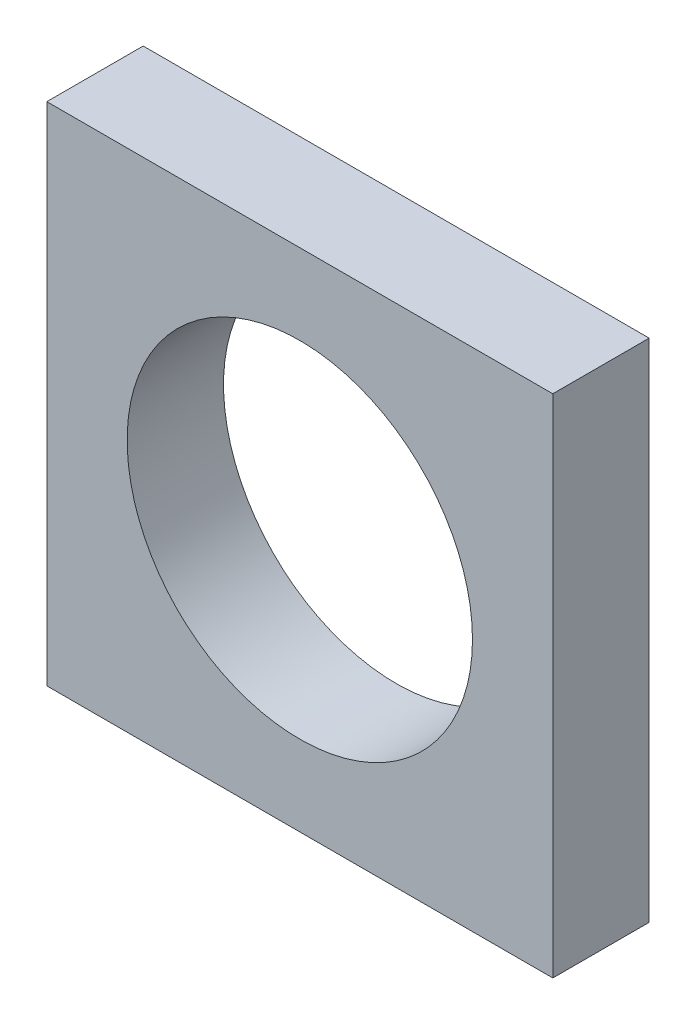
ISO-10303-21;
HEADER;
FILE_DESCRIPTION(('STEP AP214'),'2;1');
FILE_NAME('part.step','',(''),(''),'','','');
FILE_SCHEMA(('AUTOMOTIVE_DESIGN { 1 0 10303 214 1 1 1 1 }'));
ENDSEC;
DATA;
#1=APPLICATION_CONTEXT('core data for automotive mechanical design processes');
#2=APPLICATION_PROTOCOL_DEFINITION('international standard','automotive_design',2000,#1);
#3=PRODUCT_CONTEXT('',#1,'mechanical');
#4=PRODUCT('Part','Part','',(#3));
#5=PRODUCT_RELATED_PRODUCT_CATEGORY('part','',(#4));
#6=PRODUCT_DEFINITION_FORMATION('','',#4);
#7=PRODUCT_DEFINITION_CONTEXT('part definition',#1,'design');
#8=PRODUCT_DEFINITION('design','',#6,#7);
#9=PRODUCT_DEFINITION_SHAPE('','',#8);
#10=(LENGTH_UNIT() NAMED_UNIT(*) SI_UNIT(.MILLI.,.METRE.));
#11=(NAMED_UNIT(*) PLANE_ANGLE_UNIT() SI_UNIT($,.RADIAN.));
#12=(NAMED_UNIT(*) SI_UNIT($,.STERADIAN.) SOLID_ANGLE_UNIT());
#13=UNCERTAINTY_MEASURE_WITH_UNIT(LENGTH_MEASURE(1.E-05),#10,'distance_accuracy_value','');
#14=(GEOMETRIC_REPRESENTATION_CONTEXT(3) GLOBAL_UNCERTAINTY_ASSIGNED_CONTEXT((#13)) GLOBAL_UNIT_ASSIGNED_CONTEXT((#10,
#11,#12)) REPRESENTATION_CONTEXT('',''));
#15=CARTESIAN_POINT('',(0.,0.,0.));
#16=DIRECTION('',(0.,0.,1.));
#17=DIRECTION('',(1.,0.,0.));
#18=AXIS2_PLACEMENT_3D('',#15,#16,#17);
#19=CARTESIAN_POINT('',(0.,0.,6.));
#20=DIRECTION('',(0.,0.,-1.));
#21=DIRECTION('',(-1.,0.,0.));
#22=AXIS2_PLACEMENT_3D('',#19,#20,#21);
#23=PLANE('',#22);
#24=DIRECTION('',(0.,-1.,0.));
#25=VECTOR('',#24,1.);
#26=CARTESIAN_POINT('',(0.,0.,6.));
#27=LINE('',#26,#25);
#28=CARTESIAN_POINT('',(0.,31.5,6.));
#29=VERTEX_POINT('',#28);
#30=CARTESIAN_POINT('',(0.,0.,6.));
#31=VERTEX_POINT('',#30);
#32=EDGE_CURVE('E96',#29,#31,#27,.T.);
#33=ORIENTED_EDGE('',*,*,#32,.T.);
#34=DIRECTION('',(1.,0.,0.));
#35=VECTOR('',#34,1.);
#36=CARTESIAN_POINT('',(0.,0.,6.));
#37=LINE('',#36,#35);
#38=CARTESIAN_POINT('',(31.5,0.,6.));
#39=VERTEX_POINT('',#38);
#40=EDGE_CURVE('E91',#31,#39,#37,.T.);
#41=ORIENTED_EDGE('',*,*,#40,.T.);
#42=DIRECTION('',(0.,1.,0.));
#43=VECTOR('',#42,1.);
#44=CARTESIAN_POINT('',(31.5,0.,6.));
#45=LINE('',#44,#43);
#46=CARTESIAN_POINT('',(31.5,31.5,6.));
#47=VERTEX_POINT('',#46);
#48=EDGE_CURVE('E94',#39,#47,#45,.T.);
#49=ORIENTED_EDGE('',*,*,#48,.T.);
#50=DIRECTION('',(-1.,0.,0.));
#51=VECTOR('',#50,1.);
#52=CARTESIAN_POINT('',(0.,31.5,6.));
#53=LINE('',#52,#51);
#54=EDGE_CURVE('E61',#47,#29,#53,.T.);
#55=ORIENTED_EDGE('',*,*,#54,.T.);
#56=EDGE_LOOP('',(#33,#41,#49,#55));
#57=FACE_BOUND('',#56,.T.);
#58=CARTESIAN_POINT('',(15.75,15.75,6.));
#59=DIRECTION('',(0.,0.,1.));
#60=DIRECTION('',(1.,0.,0.));
#61=AXIS2_PLACEMENT_3D('',#58,#59,#60);
#62=CIRCLE('',#61,10.75);
#63=CARTESIAN_POINT('',(26.5,15.75,6.));
#64=VERTEX_POINT('',#63);
#65=EDGE_CURVE('E116',#64,#64,#62,.T.);
#66=ORIENTED_EDGE('',*,*,#65,.F.);
#67=EDGE_LOOP('',(#66));
#68=FACE_BOUND('',#67,.T.);
#69=ADVANCED_FACE('F43',(#57,#68),#23,.F.);
#70=CARTESIAN_POINT('',(0.,0.,0.));
#71=DIRECTION('',(0.,0.,-1.));
#72=DIRECTION('',(-1.,0.,0.));
#73=AXIS2_PLACEMENT_3D('',#70,#71,#72);
#74=PLANE('',#73);
#75=DIRECTION('',(0.,-1.,0.));
#76=VECTOR('',#75,1.);
#77=CARTESIAN_POINT('',(0.,0.,0.));
#78=LINE('',#77,#76);
#79=CARTESIAN_POINT('',(0.,31.5,0.));
#80=VERTEX_POINT('',#79);
#81=CARTESIAN_POINT('',(0.,0.,0.));
#82=VERTEX_POINT('',#81);
#83=EDGE_CURVE('E112',#80,#82,#78,.T.);
#84=ORIENTED_EDGE('',*,*,#83,.F.);
#85=DIRECTION('',(-1.,0.,0.));
#86=VECTOR('',#85,1.);
#87=CARTESIAN_POINT('',(0.,31.5,0.));
#88=LINE('',#87,#86);
#89=CARTESIAN_POINT('',(31.5,31.5,0.));
#90=VERTEX_POINT('',#89);
#91=EDGE_CURVE('E84',#90,#80,#88,.T.);
#92=ORIENTED_EDGE('',*,*,#91,.F.);
#93=DIRECTION('',(0.,1.,0.));
#94=VECTOR('',#93,1.);
#95=CARTESIAN_POINT('',(31.5,0.,0.));
#96=LINE('',#95,#94);
#97=CARTESIAN_POINT('',(31.5,0.,0.));
#98=VERTEX_POINT('',#97);
#99=EDGE_CURVE('E78',#98,#90,#96,.T.);
#100=ORIENTED_EDGE('',*,*,#99,.F.);
#101=DIRECTION('',(1.,0.,0.));
#102=VECTOR('',#101,1.);
#103=CARTESIAN_POINT('',(0.,0.,0.));
#104=LINE('',#103,#102);
#105=EDGE_CURVE('E101',#82,#98,#104,.T.);
#106=ORIENTED_EDGE('',*,*,#105,.F.);
#107=EDGE_LOOP('',(#84,#92,#100,#106));
#108=FACE_BOUND('',#107,.T.);
#109=CARTESIAN_POINT('',(15.75,15.75,0.));
#110=DIRECTION('',(0.,0.,1.));
#111=DIRECTION('',(1.,0.,0.));
#112=AXIS2_PLACEMENT_3D('',#109,#110,#111);
#113=CIRCLE('',#112,10.75);
#114=CARTESIAN_POINT('',(26.5,15.75,0.));
#115=VERTEX_POINT('',#114);
#116=EDGE_CURVE('E134',#115,#115,#113,.T.);
#117=ORIENTED_EDGE('',*,*,#116,.T.);
#118=EDGE_LOOP('',(#117));
#119=FACE_BOUND('',#118,.T.);
#120=ADVANCED_FACE('F129',(#108,#119),#74,.T.);
#121=CARTESIAN_POINT('',(0.,0.,6.));
#122=DIRECTION('',(1.,0.,0.));
#123=DIRECTION('',(0.,0.,-1.));
#124=AXIS2_PLACEMENT_3D('',#121,#122,#123);
#125=PLANE('',#124);
#126=ORIENTED_EDGE('',*,*,#83,.T.);
#127=DIRECTION('',(0.,0.,-1.));
#128=VECTOR('',#127,1.);
#129=CARTESIAN_POINT('',(0.,0.,6.));
#130=LINE('',#129,#128);
#131=EDGE_CURVE('E11',#31,#82,#130,.T.);
#132=ORIENTED_EDGE('',*,*,#131,.F.);
#133=ORIENTED_EDGE('',*,*,#32,.F.);
#134=DIRECTION('',(0.,0.,-1.));
#135=VECTOR('',#134,1.);
#136=CARTESIAN_POINT('',(0.,31.5,6.));
#137=LINE('',#136,#135);
#138=EDGE_CURVE('E108',#29,#80,#137,.T.);
#139=ORIENTED_EDGE('',*,*,#138,.T.);
#140=EDGE_LOOP('',(#126,#132,#133,#139));
#141=FACE_BOUND('',#140,.T.);
#142=ADVANCED_FACE('F45',(#141),#125,.F.);
#143=CARTESIAN_POINT('',(0.,0.,6.));
#144=DIRECTION('',(0.,1.,0.));
#145=DIRECTION('',(0.,0.,1.));
#146=AXIS2_PLACEMENT_3D('',#143,#144,#145);
#147=PLANE('',#146);
#148=ORIENTED_EDGE('',*,*,#105,.T.);
#149=DIRECTION('',(0.,0.,-1.));
#150=VECTOR('',#149,1.);
#151=CARTESIAN_POINT('',(31.5,0.,6.));
#152=LINE('',#151,#150);
#153=EDGE_CURVE('E53',#39,#98,#152,.T.);
#154=ORIENTED_EDGE('',*,*,#153,.F.);
#155=ORIENTED_EDGE('',*,*,#40,.F.);
#156=ORIENTED_EDGE('',*,*,#131,.T.);
#157=EDGE_LOOP('',(#148,#154,#155,#156));
#158=FACE_BOUND('',#157,.T.);
#159=ADVANCED_FACE('F100',(#158),#147,.F.);
#160=CARTESIAN_POINT('',(31.5,0.,6.));
#161=DIRECTION('',(-1.,0.,0.));
#162=DIRECTION('',(0.,0.,1.));
#163=AXIS2_PLACEMENT_3D('',#160,#161,#162);
#164=PLANE('',#163);
#165=ORIENTED_EDGE('',*,*,#99,.T.);
#166=DIRECTION('',(0.,0.,-1.));
#167=VECTOR('',#166,1.);
#168=CARTESIAN_POINT('',(31.5,31.5,6.));
#169=LINE('',#168,#167);
#170=EDGE_CURVE('E103',#47,#90,#169,.T.);
#171=ORIENTED_EDGE('',*,*,#170,.F.);
#172=ORIENTED_EDGE('',*,*,#48,.F.);
#173=ORIENTED_EDGE('',*,*,#153,.T.);
#174=EDGE_LOOP('',(#165,#171,#172,#173));
#175=FACE_BOUND('',#174,.T.);
#176=ADVANCED_FACE('F104',(#175),#164,.F.);
#177=CARTESIAN_POINT('',(0.,31.5,6.));
#178=DIRECTION('',(0.,-1.,0.));
#179=DIRECTION('',(0.,0.,-1.));
#180=AXIS2_PLACEMENT_3D('',#177,#178,#179);
#181=PLANE('',#180);
#182=ORIENTED_EDGE('',*,*,#91,.T.);
#183=ORIENTED_EDGE('',*,*,#138,.F.);
#184=ORIENTED_EDGE('',*,*,#54,.F.);
#185=ORIENTED_EDGE('',*,*,#170,.T.);
#186=EDGE_LOOP('',(#182,#183,#184,#185));
#187=FACE_BOUND('',#186,.T.);
#188=ADVANCED_FACE('F126',(#187),#181,.F.);
#189=CARTESIAN_POINT('',(15.75,15.75,6.));
#190=DIRECTION('',(0.,0.,-1.));
#191=DIRECTION('',(-1.,0.,0.));
#192=AXIS2_PLACEMENT_3D('',#189,#190,#191);
#193=CYLINDRICAL_SURFACE('',#192,10.75);
#194=ORIENTED_EDGE('',*,*,#65,.T.);
#195=EDGE_LOOP('',(#194));
#196=FACE_BOUND('',#195,.T.);
#197=ORIENTED_EDGE('',*,*,#116,.F.);
#198=EDGE_LOOP('',(#197));
#199=FACE_BOUND('',#198,.T.);
#200=ADVANCED_FACE('F142',(#196,#199),#193,.F.);
#201=CLOSED_SHELL('',(#69,#120,#142,#159,#176,#188,#200));
#202=MANIFOLD_SOLID_BREP('B2',#201);
#203=ADVANCED_BREP_SHAPE_REPRESENTATION('',(#18,#202),#14);
#204=SHAPE_DEFINITION_REPRESENTATION(#9,#203);
ENDSEC;
END-ISO-10303-21;
